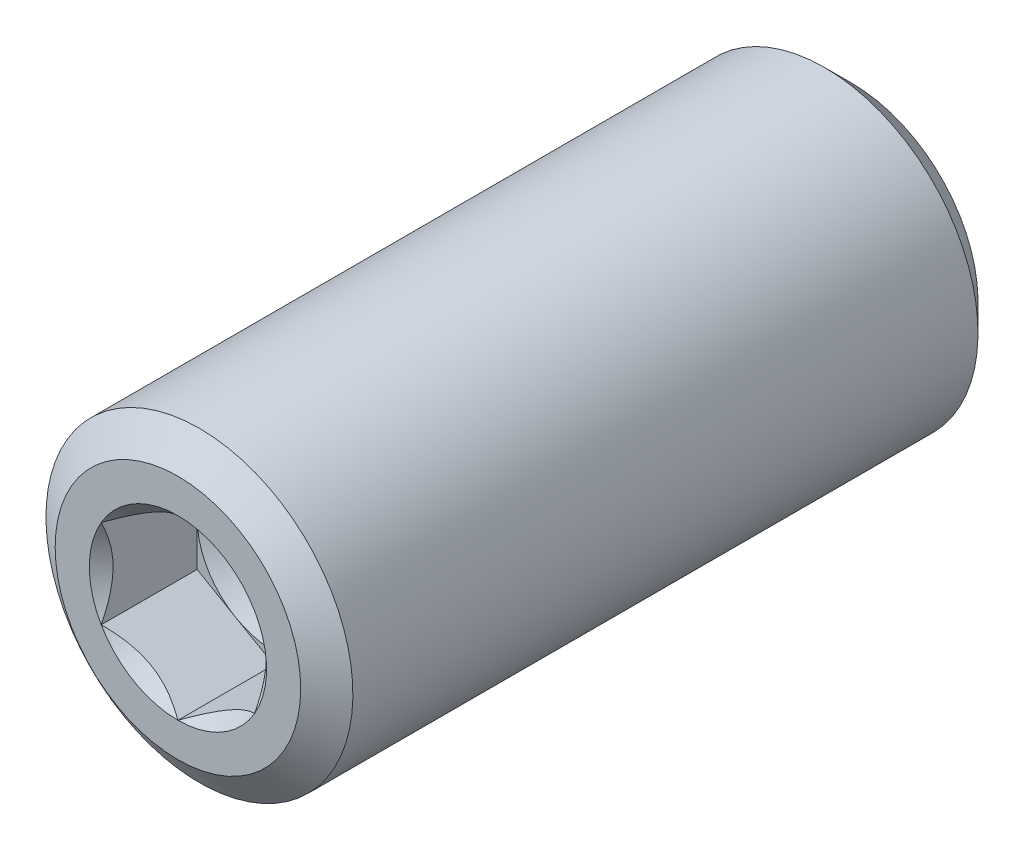
ISO-10303-21;
HEADER;
FILE_DESCRIPTION(('STEP AP214'),'2;1');
FILE_NAME('part.step','',(''),(''),'','','');
FILE_SCHEMA(('AUTOMOTIVE_DESIGN { 1 0 10303 214 1 1 1 1 }'));
ENDSEC;
DATA;
#1=APPLICATION_CONTEXT('core data for automotive mechanical design processes');
#2=APPLICATION_PROTOCOL_DEFINITION('international standard','automotive_design',2000,#1);
#3=PRODUCT_CONTEXT('',#1,'mechanical');
#4=PRODUCT('Part','Part','',(#3));
#5=PRODUCT_RELATED_PRODUCT_CATEGORY('part','',(#4));
#6=PRODUCT_DEFINITION_FORMATION('','',#4);
#7=PRODUCT_DEFINITION_CONTEXT('part definition',#1,'design');
#8=PRODUCT_DEFINITION('design','',#6,#7);
#9=PRODUCT_DEFINITION_SHAPE('','',#8);
#10=(LENGTH_UNIT() NAMED_UNIT(*) SI_UNIT(.MILLI.,.METRE.));
#11=(NAMED_UNIT(*) PLANE_ANGLE_UNIT() SI_UNIT($,.RADIAN.));
#12=(NAMED_UNIT(*) SI_UNIT($,.STERADIAN.) SOLID_ANGLE_UNIT());
#13=UNCERTAINTY_MEASURE_WITH_UNIT(LENGTH_MEASURE(1.E-05),#10,'distance_accuracy_value','');
#14=(GEOMETRIC_REPRESENTATION_CONTEXT(3) GLOBAL_UNCERTAINTY_ASSIGNED_CONTEXT((#13)) GLOBAL_UNIT_ASSIGNED_CONTEXT((#10,
#11,#12)) REPRESENTATION_CONTEXT('',''));
#15=CARTESIAN_POINT('',(0.,0.,0.));
#16=DIRECTION('',(0.,0.,1.));
#17=DIRECTION('',(1.,0.,0.));
#18=AXIS2_PLACEMENT_3D('',#15,#16,#17);
#19=CARTESIAN_POINT('',(0.,0.,-6.));
#20=DIRECTION('',(0.,0.,-1.));
#21=DIRECTION('',(0.,1.,0.));
#22=AXIS2_PLACEMENT_3D('',#19,#20,#21);
#23=SPHERICAL_SURFACE('',#22,1.5);
#24=CARTESIAN_POINT('',(0.,0.,-7.5));
#25=VERTEX_POINT('',#24);
#26=VERTEX_LOOP('',#25);
#27=FACE_BOUND('',#26,.T.);
#28=ADVANCED_FACE('F42',(#27),#23,.T.);
#29=CLOSED_SHELL('',(#28));
#30=MANIFOLD_SOLID_BREP('B2',#29);
#31=CARTESIAN_POINT('',(1.25,0.72168783648705,2.9375));
#32=DIRECTION('',(0.,0.,-1.));
#33=DIRECTION('',(-1.,0.,0.));
#34=AXIS2_PLACEMENT_3D('',#31,#32,#33);
#35=PLANE('',#34);
#36=DIRECTION('',(0.,-1.,0.));
#37=VECTOR('',#36,1.);
#38=CARTESIAN_POINT('',(-1.25,0.72168783648705,2.9375));
#39=LINE('',#38,#37);
#40=CARTESIAN_POINT('',(-1.25,0.72168783648705,2.9375));
#41=VERTEX_POINT('',#40);
#42=CARTESIAN_POINT('',(-1.25,0.,2.9375));
#43=VERTEX_POINT('',#42);
#44=EDGE_CURVE('E173',#41,#43,#39,.T.);
#45=ORIENTED_EDGE('',*,*,#44,.T.);
#46=CARTESIAN_POINT('',(0.,0.,2.9375));
#47=DIRECTION('',(0.,0.,1.));
#48=DIRECTION('',(1.,0.,0.));
#49=AXIS2_PLACEMENT_3D('',#46,#47,#48);
#50=CIRCLE('',#49,1.25);
#51=CARTESIAN_POINT('',(-0.625,1.08253175473057,2.9375));
#52=VERTEX_POINT('',#51);
#53=EDGE_CURVE('E70',#52,#43,#50,.T.);
#54=ORIENTED_EDGE('',*,*,#53,.F.);
#55=DIRECTION('',(-0.866025403784439,-0.5,0.));
#56=VECTOR('',#55,1.);
#57=CARTESIAN_POINT('',(0.,1.44337567297408,2.9375));
#58=LINE('',#57,#56);
#59=EDGE_CURVE('E162',#52,#41,#58,.T.);
#60=ORIENTED_EDGE('',*,*,#59,.T.);
#61=EDGE_LOOP('',(#45,#54,#60));
#62=FACE_BOUND('',#61,.T.);
#63=ADVANCED_FACE('F55',(#62),#35,.F.);
#64=CARTESIAN_POINT('',(0.,1.44337567297408,2.9375));
#65=VERTEX_POINT('',#64);
#66=EDGE_CURVE('E149',#65,#52,#58,.T.);
#67=ORIENTED_EDGE('',*,*,#66,.T.);
#68=CARTESIAN_POINT('',(0.625,1.08253175473057,2.9375));
#69=VERTEX_POINT('',#68);
#70=EDGE_CURVE('E135',#69,#52,#50,.T.);
#71=ORIENTED_EDGE('',*,*,#70,.F.);
#72=DIRECTION('',(-0.866025403784439,0.5,0.));
#73=VECTOR('',#72,1.);
#74=CARTESIAN_POINT('',(1.25,0.72168783648705,2.9375));
#75=LINE('',#74,#73);
#76=EDGE_CURVE('E146',#69,#65,#75,.T.);
#77=ORIENTED_EDGE('',*,*,#76,.T.);
#78=EDGE_LOOP('',(#67,#71,#77));
#79=FACE_BOUND('',#78,.T.);
#80=ADVANCED_FACE('F145',(#79),#35,.F.);
#81=CARTESIAN_POINT('',(1.25,0.72168783648705,2.9375));
#82=VERTEX_POINT('',#81);
#83=EDGE_CURVE('E153',#82,#69,#75,.T.);
#84=ORIENTED_EDGE('',*,*,#83,.T.);
#85=CARTESIAN_POINT('',(1.25,0.,2.9375));
#86=VERTEX_POINT('',#85);
#87=EDGE_CURVE('E133',#86,#69,#50,.T.);
#88=ORIENTED_EDGE('',*,*,#87,.F.);
#89=DIRECTION('',(0.,1.,0.));
#90=VECTOR('',#89,1.);
#91=CARTESIAN_POINT('',(1.25,-0.721687836487016,2.9375));
#92=LINE('',#91,#90);
#93=EDGE_CURVE('E160',#86,#82,#92,.T.);
#94=ORIENTED_EDGE('',*,*,#93,.T.);
#95=EDGE_LOOP('',(#84,#88,#94));
#96=FACE_BOUND('',#95,.T.);
#97=ADVANCED_FACE('F159',(#96),#35,.F.);
#98=CARTESIAN_POINT('',(1.25,-0.721687836487016,2.9375));
#99=VERTEX_POINT('',#98);
#100=EDGE_CURVE('E184',#99,#86,#92,.T.);
#101=ORIENTED_EDGE('',*,*,#100,.T.);
#102=CARTESIAN_POINT('',(0.625,-1.08253175473053,2.9375));
#103=VERTEX_POINT('',#102);
#104=EDGE_CURVE('E137',#103,#86,#50,.T.);
#105=ORIENTED_EDGE('',*,*,#104,.F.);
#106=DIRECTION('',(0.866025403784439,0.5,0.));
#107=VECTOR('',#106,1.);
#108=CARTESIAN_POINT('',(0.,-1.44337567297405,2.9375));
#109=LINE('',#108,#107);
#110=EDGE_CURVE('E180',#103,#99,#109,.T.);
#111=ORIENTED_EDGE('',*,*,#110,.T.);
#112=EDGE_LOOP('',(#101,#105,#111));
#113=FACE_BOUND('',#112,.T.);
#114=ADVANCED_FACE('F287',(#113),#35,.F.);
#115=CARTESIAN_POINT('',(0.,-1.44337567297405,2.9375));
#116=VERTEX_POINT('',#115);
#117=EDGE_CURVE('E181',#116,#103,#109,.T.);
#118=ORIENTED_EDGE('',*,*,#117,.T.);
#119=CARTESIAN_POINT('',(-0.625000000000001,-1.08253175473053,2.9375));
#120=VERTEX_POINT('',#119);
#121=EDGE_CURVE('E298',#120,#103,#50,.T.);
#122=ORIENTED_EDGE('',*,*,#121,.F.);
#123=DIRECTION('',(0.866025403784439,-0.5,0.));
#124=VECTOR('',#123,1.);
#125=CARTESIAN_POINT('',(-1.25,-0.721687836487015,2.9375));
#126=LINE('',#125,#124);
#127=EDGE_CURVE('E176',#120,#116,#126,.T.);
#128=ORIENTED_EDGE('',*,*,#127,.T.);
#129=EDGE_LOOP('',(#118,#122,#128));
#130=FACE_BOUND('',#129,.T.);
#131=ADVANCED_FACE('F283',(#130),#35,.F.);
#132=CARTESIAN_POINT('',(0.,0.,-6.));
#133=DIRECTION('',(0.,0.,-1.));
#134=DIRECTION('',(0.,-1.,0.));
#135=AXIS2_PLACEMENT_3D('',#132,#133,#134);
#136=SPHERICAL_SURFACE('',#135,1.55);
#137=CARTESIAN_POINT('',(0.,0.,-6.48));
#138=DIRECTION('',(0.,0.,-1.));
#139=DIRECTION('',(0.,1.,0.));
#140=AXIS2_PLACEMENT_3D('',#137,#138,#139);
#141=CIRCLE('',#140,1.47380460034565);
#142=CARTESIAN_POINT('',(0.,1.47380460034565,-6.48));
#143=VERTEX_POINT('',#142);
#144=EDGE_CURVE('E59',#143,#143,#141,.T.);
#145=ORIENTED_EDGE('',*,*,#144,.T.);
#146=EDGE_LOOP('',(#145));
#147=FACE_BOUND('',#146,.T.);
#148=ADVANCED_FACE('F57',(#147),#136,.F.);
#149=CARTESIAN_POINT('',(0.,2.05311588712133,-6.48));
#150=DIRECTION('',(0.,0.,-1.));
#151=DIRECTION('',(0.,1.,0.));
#152=AXIS2_PLACEMENT_3D('',#149,#150,#151);
#153=PLANE('',#152);
#154=CARTESIAN_POINT('',(0.,0.,-6.48));
#155=DIRECTION('',(0.,0.,-1.));
#156=DIRECTION('',(0.,1.,0.));
#157=AXIS2_PLACEMENT_3D('',#154,#155,#156);
#158=CIRCLE('',#157,2.05311588712133);
#159=CARTESIAN_POINT('',(0.,2.05311588712133,-6.48));
#160=VERTEX_POINT('',#159);
#161=EDGE_CURVE('E210',#160,#160,#158,.T.);
#162=ORIENTED_EDGE('',*,*,#161,.T.);
#163=EDGE_LOOP('',(#162));
#164=FACE_BOUND('',#163,.T.);
#165=ORIENTED_EDGE('',*,*,#144,.F.);
#166=EDGE_LOOP('',(#165));
#167=FACE_BOUND('',#166,.T.);
#168=ADVANCED_FACE('F293',(#164,#167),#153,.T.);
#169=CARTESIAN_POINT('',(0.,0.,-6.48));
#170=DIRECTION('',(0.,0.,1.));
#171=DIRECTION('',(0.,-1.,0.));
#172=AXIS2_PLACEMENT_3D('',#169,#170,#171);
#173=CONICAL_SURFACE('',#172,2.05311588712133,0.785398163397457);
#174=CARTESIAN_POINT('',(0.,0.,-6.03311588712133));
#175=DIRECTION('',(0.,0.,-1.));
#176=DIRECTION('',(0.,1.,0.));
#177=AXIS2_PLACEMENT_3D('',#174,#175,#176);
#178=CIRCLE('',#177,2.5);
#179=CARTESIAN_POINT('',(0.,2.5,-6.03311588712133));
#180=VERTEX_POINT('',#179);
#181=EDGE_CURVE('E207',#180,#180,#178,.T.);
#182=ORIENTED_EDGE('',*,*,#181,.T.);
#183=EDGE_LOOP('',(#182));
#184=FACE_BOUND('',#183,.T.);
#185=ORIENTED_EDGE('',*,*,#161,.F.);
#186=EDGE_LOOP('',(#185));
#187=FACE_BOUND('',#186,.T.);
#188=ADVANCED_FACE('F367',(#184,#187),#173,.T.);
#189=CARTESIAN_POINT('',(0.,0.,-7.5));
#190=DIRECTION('',(0.,0.,-1.));
#191=DIRECTION('',(0.,1.,0.));
#192=AXIS2_PLACEMENT_3D('',#189,#190,#191);
#193=CYLINDRICAL_SURFACE('',#192,2.5);
#194=CARTESIAN_POINT('',(0.,0.,4.14989623089515));
#195=DIRECTION('',(0.,0.,-1.));
#196=DIRECTION('',(0.,1.,0.));
#197=AXIS2_PLACEMENT_3D('',#194,#195,#196);
#198=CIRCLE('',#197,2.5);
#199=CARTESIAN_POINT('',(0.,2.5,4.14989623089515));
#200=VERTEX_POINT('',#199);
#201=EDGE_CURVE('E204',#200,#200,#198,.T.);
#202=ORIENTED_EDGE('',*,*,#201,.T.);
#203=EDGE_LOOP('',(#202));
#204=FACE_BOUND('',#203,.T.);
#205=ORIENTED_EDGE('',*,*,#181,.F.);
#206=EDGE_LOOP('',(#205));
#207=FACE_BOUND('',#206,.T.);
#208=ADVANCED_FACE('F360',(#204,#207),#193,.T.);
#209=CARTESIAN_POINT('',(0.,0.,4.14989623089515));
#210=DIRECTION('',(0.,0.,-1.));
#211=DIRECTION('',(0.,1.,0.));
#212=AXIS2_PLACEMENT_3D('',#209,#210,#211);
#213=CONICAL_SURFACE('',#212,2.5,0.959931088596883);
#214=CARTESIAN_POINT('',(0.,0.,4.5));
#215=DIRECTION('',(0.,0.,-1.));
#216=DIRECTION('',(0.,1.,0.));
#217=AXIS2_PLACEMENT_3D('',#214,#215,#216);
#218=CIRCLE('',#217,2.);
#219=CARTESIAN_POINT('',(0.,2.,4.5));
#220=VERTEX_POINT('',#219);
#221=EDGE_CURVE('E189',#220,#220,#218,.T.);
#222=ORIENTED_EDGE('',*,*,#221,.T.);
#223=EDGE_LOOP('',(#222));
#224=FACE_BOUND('',#223,.T.);
#225=ORIENTED_EDGE('',*,*,#201,.F.);
#226=EDGE_LOOP('',(#225));
#227=FACE_BOUND('',#226,.T.);
#228=ADVANCED_FACE('F355',(#224,#227),#213,.T.);
#229=CARTESIAN_POINT('',(0.,0.,4.5));
#230=DIRECTION('',(0.,0.,1.));
#231=DIRECTION('',(0.,-1.,0.));
#232=AXIS2_PLACEMENT_3D('',#229,#230,#231);
#233=PLANE('',#232);
#234=CARTESIAN_POINT('',(0.,0.,4.5));
#235=DIRECTION('',(0.,0.,1.));
#236=DIRECTION('',(1.,0.,0.));
#237=AXIS2_PLACEMENT_3D('',#234,#235,#236);
#238=CIRCLE('',#237,1.44337567297408);
#239=CARTESIAN_POINT('',(0.,-1.44337567297408,4.5));
#240=VERTEX_POINT('',#239);
#241=CARTESIAN_POINT('',(1.25000000000004,-0.721687836486995,4.5));
#242=VERTEX_POINT('',#241);
#243=EDGE_CURVE('E314',#240,#242,#238,.T.);
#244=ORIENTED_EDGE('',*,*,#243,.F.);
#245=CARTESIAN_POINT('',(-1.25,-0.721687836487015,4.5));
#246=VERTEX_POINT('',#245);
#247=EDGE_CURVE('E315',#246,#240,#238,.T.);
#248=ORIENTED_EDGE('',*,*,#247,.F.);
#249=CARTESIAN_POINT('',(-1.25000000000001,0.721687836487045,4.5));
#250=VERTEX_POINT('',#249);
#251=EDGE_CURVE('E313',#250,#246,#238,.T.);
#252=ORIENTED_EDGE('',*,*,#251,.F.);
#253=CARTESIAN_POINT('',(0.,1.44337567297408,4.5));
#254=VERTEX_POINT('',#253);
#255=EDGE_CURVE('E308',#254,#250,#238,.T.);
#256=ORIENTED_EDGE('',*,*,#255,.F.);
#257=CARTESIAN_POINT('',(1.25,0.721687836487061,4.5));
#258=VERTEX_POINT('',#257);
#259=EDGE_CURVE('E307',#258,#254,#238,.T.);
#260=ORIENTED_EDGE('',*,*,#259,.F.);
#261=EDGE_CURVE('E77',#242,#258,#238,.T.);
#262=ORIENTED_EDGE('',*,*,#261,.F.);
#263=EDGE_LOOP('',(#244,#248,#252,#256,#260,#262));
#264=FACE_BOUND('',#263,.T.);
#265=ORIENTED_EDGE('',*,*,#221,.F.);
#266=EDGE_LOOP('',(#265));
#267=FACE_BOUND('',#266,.T.);
#268=ADVANCED_FACE('F327',(#264,#267),#233,.T.);
#269=CARTESIAN_POINT('',(0.,0.,4.5));
#270=DIRECTION('',(0.,0.,1.));
#271=DIRECTION('',(1.,0.,0.));
#272=AXIS2_PLACEMENT_3D('',#269,#270,#271);
#273=CONICAL_SURFACE('',#272,1.44337567297408,0.78539816339745);
#274=ORIENTED_EDGE('',*,*,#255,.T.);
#275=CARTESIAN_POINT('',(0.000200000000000185,1.44349114302792,4.50011548390914));
#276=CARTESIAN_POINT('',(-0.0427751670715872,1.41867941875067,4.47532166805511));
#277=CARTESIAN_POINT('',(-0.0864690047459489,1.39345276980745,4.45198373441869));
#278=CARTESIAN_POINT('',(-0.175565930841944,1.34201263554196,4.40925200408454));
#279=CARTESIAN_POINT('',(-0.220977498357066,1.31579425481278,4.38988199236042));
#280=CARTESIAN_POINT('',(-0.312547820935263,1.26292610442248,4.35670048341348));
#281=CARTESIAN_POINT('',(-0.358683240175889,1.23628980770472,4.34280555905266));
#282=CARTESIAN_POINT('',(-0.451970080407597,1.1824306253851,4.32139728216064));
#283=CARTESIAN_POINT('',(-0.499118649136385,1.15520938653763,4.31386794156679));
#284=CARTESIAN_POINT('',(-0.580373556887258,1.10829684367468,4.3070744980507));
#285=CARTESIAN_POINT('',(-0.614374876627947,1.08866617256959,4.30606855910435));
#286=CARTESIAN_POINT('',(-0.682317764432484,1.04943932800612,4.30776141491132));
#287=CARTESIAN_POINT('',(-0.716259317655665,1.02984316311601,4.31046102721554));
#288=CARTESIAN_POINT('',(-0.783814856457508,0.990839954603512,4.31940893031638));
#289=CARTESIAN_POINT('',(-0.817428507286784,0.971433104248784,4.32566052589971));
#290=CARTESIAN_POINT('',(-0.884094638217822,0.932943395609918,4.34137568141391));
#291=CARTESIAN_POINT('',(-0.917146871030305,0.913860680098312,4.35084062008746));
#292=CARTESIAN_POINT('',(-1.00179969160027,0.864986351354581,4.37893139068759));
#293=CARTESIAN_POINT('',(-1.05286649242964,0.83550292014909,4.3996701574522));
#294=CARTESIAN_POINT('',(-1.15300085411326,0.777690319475924,4.44638713467147));
#295=CARTESIAN_POINT('',(-1.20207431157827,0.749357745598433,4.47234829594676));
#296=CARTESIAN_POINT('',(-1.2502,0.721572366433212,4.50011548390913));
#297=B_SPLINE_CURVE_WITH_KNOTS('',3,(#275,#276,#277,#278,#279,#280,#281,#282,#283,#284,#285,
#286,#287,#288,#289,#290,#291,#292,#293,#294,#295,#296),.UNSPECIFIED.,.F.,.F.,(4,2,2,2,2,2,2,2,
2,2,4),(0.,0.166533409618305,0.334037607289765,0.498880396489704,0.663307919240281,
0.780963963458835,0.898645970148462,1.01643764860774,1.13427993171551,1.32148652032141,
1.50809158792573),.UNSPECIFIED.);
#298=EDGE_CURVE('E40',#254,#250,#297,.T.);
#299=ORIENTED_EDGE('',*,*,#298,.F.);
#300=EDGE_LOOP('',(#274,#299));
#301=FACE_BOUND('',#300,.T.);
#302=ADVANCED_FACE('F226',(#301),#273,.F.);
#303=ORIENTED_EDGE('',*,*,#251,.T.);
#304=CARTESIAN_POINT('',(-1.25,-1.43934010808075,4.9629820968923));
#305=CARTESIAN_POINT('',(-1.25,-1.40429313005656,4.93652492263286));
#306=CARTESIAN_POINT('',(-1.25,-1.36905087135597,4.91032716035425));
#307=CARTESIAN_POINT('',(-1.25,-1.29809650706309,4.85855757183956));
#308=CARTESIAN_POINT('',(-1.25,-1.26238428576493,4.83298590435627));
#309=CARTESIAN_POINT('',(-1.25,-1.15390111792706,4.75700599368944));
#310=CARTESIAN_POINT('',(-1.25,-1.08031646726262,4.70774028618954));
#311=CARTESIAN_POINT('',(-1.25,-0.926012322755079,4.61102583026311));
#312=CARTESIAN_POINT('',(-1.25,-0.845125318656131,4.56384129894178));
#313=CARTESIAN_POINT('',(-1.25,-0.679311174076589,4.4775307343904));
#314=CARTESIAN_POINT('',(-1.25,-0.594398891026676,4.43837753462688));
#315=CARTESIAN_POINT('',(-1.25,-0.46694481246073,4.39047722368828));
#316=CARTESIAN_POINT('',(-1.25,-0.426289985812812,4.37672948978632));
#317=CARTESIAN_POINT('',(-1.25,-0.343998850091258,4.35249792745053));
#318=CARTESIAN_POINT('',(-1.25,-0.302362473614953,4.34201432386976));
#319=CARTESIAN_POINT('',(-1.25,-0.219052696285657,4.32503016174828));
#320=CARTESIAN_POINT('',(-1.25,-0.177393428474491,4.31846136047136));
#321=CARTESIAN_POINT('',(-1.25,-0.0936293693401842,4.30943505345775));
#322=CARTESIAN_POINT('',(-1.25,-0.0515246558543884,4.30697684099725));
#323=CARTESIAN_POINT('',(-1.25,0.0311890576306385,4.30635406201327));
#324=CARTESIAN_POINT('',(-1.25,0.071796962549937,4.30803711684623));
#325=CARTESIAN_POINT('',(-1.25,0.152668636885203,4.3152682705979));
#326=CARTESIAN_POINT('',(-1.25,0.192932338835364,4.3208171104131));
#327=CARTESIAN_POINT('',(-1.25,0.2734998791653,4.33557103646494));
#328=CARTESIAN_POINT('',(-1.25,0.313792180618516,4.34483817596409));
#329=CARTESIAN_POINT('',(-1.25,0.393496413911461,4.36653617845734));
#330=CARTESIAN_POINT('',(-1.25,0.432908419115063,4.37896677673063));
#331=CARTESIAN_POINT('',(-1.25,0.556992735862302,4.42277935293142));
#332=CARTESIAN_POINT('',(-1.25,0.63989892466609,4.45915107287594));
#333=CARTESIAN_POINT('',(-1.25,0.801816555499706,4.54001916217832));
#334=CARTESIAN_POINT('',(-1.25,0.88081266632505,4.58454472091198));
#335=CARTESIAN_POINT('',(-1.25,1.0317856127975,4.67640487666662));
#336=CARTESIAN_POINT('',(-1.25,1.10391618485086,4.72348993391624));
#337=CARTESIAN_POINT('',(-1.25,1.21018606043311,4.79627856159853));
#338=CARTESIAN_POINT('',(-1.25,1.2451506996938,4.82079808539335));
#339=CARTESIAN_POINT('',(-1.25,1.31460220852737,4.87048563676567));
#340=CARTESIAN_POINT('',(-1.25,1.34908920596619,4.89565348541551));
#341=CARTESIAN_POINT('',(-1.25,1.38337731682912,4.9210901488412));
#342=B_SPLINE_CURVE_WITH_KNOTS('',3,(#304,#305,#306,#307,#308,#309,#310,#311,#312,#313,#314,
#315,#316,#317,#318,#319,#320,#321,#322,#323,#324,#325,#326,#327,#328,#329,#330,#331,#332,#333,
#334,#335,#336,#337,#338,#339,#340,#341),.UNSPECIFIED.,.F.,.F.,(4,2,2,2,2,2,2,2,2,2,2,2,2,2,2,2,
2,2,4),(0.,0.131732960381446,0.26349898416164,0.529042014455817,0.809741926134606,
1.08947609717223,1.21811634272575,1.34676544783898,1.47310084517842,1.59941451973782,
1.72115042167847,1.84290966131733,1.96679153905339,2.09066305366037,2.36146692896007,
2.63325989198489,2.89154668212277,3.01965734507711,3.14773302245626),.UNSPECIFIED.);
#343=EDGE_CURVE('E233',#250,#246,#342,.F.);
#344=ORIENTED_EDGE('',*,*,#343,.F.);
#345=EDGE_LOOP('',(#303,#344));
#346=FACE_BOUND('',#345,.T.);
#347=ADVANCED_FACE('F324',(#346),#273,.F.);
#348=ORIENTED_EDGE('',*,*,#247,.T.);
#349=CARTESIAN_POINT('',(-1.2502,-0.721572366433177,4.50011548390911));
#350=CARTESIAN_POINT('',(-1.20722483292841,-0.746384090710427,4.47532166805508));
#351=CARTESIAN_POINT('',(-1.16353099525405,-0.771610739653648,4.45198373441866));
#352=CARTESIAN_POINT('',(-1.07443406915806,-0.823050873919139,4.40925200408451));
#353=CARTESIAN_POINT('',(-1.02902250164293,-0.849269254648317,4.38988199236039));
#354=CARTESIAN_POINT('',(-0.937452179064738,-0.90213740503862,4.35670048341345));
#355=CARTESIAN_POINT('',(-0.891316759824112,-0.928773701756372,4.34280555905263));
#356=CARTESIAN_POINT('',(-0.798029919592404,-0.982632884075998,4.32139728216061));
#357=CARTESIAN_POINT('',(-0.750881350863616,-1.00985412292347,4.31386794156676));
#358=CARTESIAN_POINT('',(-0.669626443112743,-1.05676666578641,4.30707449805068));
#359=CARTESIAN_POINT('',(-0.635625123372055,-1.0763973368915,4.30606855910432));
#360=CARTESIAN_POINT('',(-0.567682235567519,-1.11562418145497,4.30776141491129));
#361=CARTESIAN_POINT('',(-0.533740682344339,-1.13522034634509,4.31046102721551));
#362=CARTESIAN_POINT('',(-0.466185143542498,-1.17422355485758,4.31940893031635));
#363=CARTESIAN_POINT('',(-0.432571492713223,-1.19363040521231,4.32566052589968));
#364=CARTESIAN_POINT('',(-0.365905361782186,-1.23212011385118,4.34137568141388));
#365=CARTESIAN_POINT('',(-0.332853128969703,-1.25120282936278,4.35084062008743));
#366=CARTESIAN_POINT('',(-0.248200308399735,-1.30007715810651,4.37893139068756));
#367=CARTESIAN_POINT('',(-0.197133507570361,-1.329560589312,4.39967015745217));
#368=CARTESIAN_POINT('',(-0.0969991458867451,-1.38737318998517,4.44638713467145));
#369=CARTESIAN_POINT('',(-0.0479256884217306,-1.41570576386266,4.47234829594674));
#370=CARTESIAN_POINT('',(0.000199999999999671,-1.44349114302789,4.50011548390911));
#371=B_SPLINE_CURVE_WITH_KNOTS('',3,(#349,#350,#351,#352,#353,#354,#355,#356,#357,#358,#359,
#360,#361,#362,#363,#364,#365,#366,#367,#368,#369,#370),.UNSPECIFIED.,.F.,.F.,(4,2,2,2,2,2,2,2,
2,2,4),(0.,0.166533409618305,0.334037607289765,0.498880396489703,0.663307919240281,
0.780963963458832,0.898645970148458,1.01643764860774,1.1342799317155,1.32148652032141,
1.50809158792574),.UNSPECIFIED.);
#372=EDGE_CURVE('E240',#246,#240,#371,.T.);
#373=ORIENTED_EDGE('',*,*,#372,.F.);
#374=EDGE_LOOP('',(#348,#373));
#375=FACE_BOUND('',#374,.T.);
#376=ADVANCED_FACE('F342',(#375),#273,.F.);
#377=ORIENTED_EDGE('',*,*,#243,.T.);
#378=CARTESIAN_POINT('',(-0.000200000000000397,-1.44349114302789,4.50011548390911));
#379=CARTESIAN_POINT('',(0.0427751670715855,-1.41867941875064,4.47532166805508));
#380=CARTESIAN_POINT('',(0.0864690047459463,-1.39345276980742,4.45198373441866));
#381=CARTESIAN_POINT('',(0.175565930841939,-1.34201263554193,4.40925200408451));
#382=CARTESIAN_POINT('',(0.220977498357061,-1.31579425481275,4.38988199236039));
#383=CARTESIAN_POINT('',(0.312547820935256,-1.26292610442245,4.35670048341345));
#384=CARTESIAN_POINT('',(0.358683240175881,-1.2362898077047,4.34280555905263));
#385=CARTESIAN_POINT('',(0.451970080407586,-1.18243062538507,4.32139728216061));
#386=CARTESIAN_POINT('',(0.499118649136373,-1.1552093865376,4.31386794156676));
#387=CARTESIAN_POINT('',(0.580373556887245,-1.10829684367466,4.30707449805068));
#388=CARTESIAN_POINT('',(0.614374876627933,-1.08866617256957,4.30606855910432));
#389=CARTESIAN_POINT('',(0.682317764432469,-1.0494393280061,4.30776141491129));
#390=CARTESIAN_POINT('',(0.716259317655649,-1.02984316311598,4.31046102721551));
#391=CARTESIAN_POINT('',(0.78381485645749,-0.990839954603488,4.31940893031635));
#392=CARTESIAN_POINT('',(0.817428507286765,-0.97143310424876,4.32566052589968));
#393=CARTESIAN_POINT('',(0.884094638217802,-0.932943395609895,4.34137568141388));
#394=CARTESIAN_POINT('',(0.917146871030284,-0.91386068009829,4.35084062008743));
#395=CARTESIAN_POINT('',(1.00179969160025,-0.864986351354557,4.37893139068756));
#396=CARTESIAN_POINT('',(1.05286649242963,-0.835502920149063,4.39967015745218));
#397=CARTESIAN_POINT('',(1.15300085411325,-0.777690319475894,4.44638713467145));
#398=CARTESIAN_POINT('',(1.20207431157827,-0.749357745598401,4.47234829594674));
#399=CARTESIAN_POINT('',(1.2502,-0.721572366433178,4.50011548390911));
#400=B_SPLINE_CURVE_WITH_KNOTS('',3,(#378,#379,#380,#381,#382,#383,#384,#385,#386,#387,#388,
#389,#390,#391,#392,#393,#394,#395,#396,#397,#398,#399),.UNSPECIFIED.,.F.,.F.,(4,2,2,2,2,2,2,2,
2,2,4),(0.,0.166533409618301,0.334037607289758,0.498880396489692,0.663307919240266,
0.780963963458817,0.898645970148442,1.01643764860772,1.13427993171548,1.3214865203214,
1.50809158792574),.UNSPECIFIED.);
#401=EDGE_CURVE('E246',#240,#242,#400,.T.);
#402=ORIENTED_EDGE('',*,*,#401,.F.);
#403=EDGE_LOOP('',(#377,#402));
#404=FACE_BOUND('',#403,.T.);
#405=ADVANCED_FACE('F338',(#404),#273,.F.);
#406=ORIENTED_EDGE('',*,*,#261,.T.);
#407=CARTESIAN_POINT('',(1.25,-1.43934010808075,4.9629820968923));
#408=CARTESIAN_POINT('',(1.25,-1.40429313005657,4.93652492263286));
#409=CARTESIAN_POINT('',(1.25,-1.36905087135597,4.91032716035425));
#410=CARTESIAN_POINT('',(1.25,-1.29809650706309,4.85855757183956));
#411=CARTESIAN_POINT('',(1.25,-1.26238428576493,4.83298590435627));
#412=CARTESIAN_POINT('',(1.25,-1.15390111792706,4.75700599368944));
#413=CARTESIAN_POINT('',(1.25,-1.08031646726263,4.70774028618954));
#414=CARTESIAN_POINT('',(1.25,-0.926012322755081,4.61102583026311));
#415=CARTESIAN_POINT('',(1.25,-0.845125318656133,4.56384129894178));
#416=CARTESIAN_POINT('',(1.25,-0.67931117407659,4.4775307343904));
#417=CARTESIAN_POINT('',(1.25,-0.594398891026677,4.43837753462688));
#418=CARTESIAN_POINT('',(1.25,-0.466944812460731,4.39047722368828));
#419=CARTESIAN_POINT('',(1.25,-0.426289985812812,4.37672948978632));
#420=CARTESIAN_POINT('',(1.25,-0.343998850091259,4.35249792745053));
#421=CARTESIAN_POINT('',(1.25,-0.302362473614954,4.34201432386976));
#422=CARTESIAN_POINT('',(1.25,-0.219052696285658,4.32503016174828));
#423=CARTESIAN_POINT('',(1.25,-0.177393428474492,4.31846136047136));
#424=CARTESIAN_POINT('',(1.25,-0.0936293693401853,4.30943505345775));
#425=CARTESIAN_POINT('',(1.25,-0.0515246558543896,4.30697684099725));
#426=CARTESIAN_POINT('',(1.25,0.0311890576306374,4.30635406201327));
#427=CARTESIAN_POINT('',(1.25,0.0717969625499359,4.30803711684623));
#428=CARTESIAN_POINT('',(1.25,0.152668636885202,4.3152682705979));
#429=CARTESIAN_POINT('',(1.25,0.192932338835363,4.32081711041309));
#430=CARTESIAN_POINT('',(1.25,0.273499879165299,4.33557103646494));
#431=CARTESIAN_POINT('',(1.25,0.313792180618515,4.34483817596409));
#432=CARTESIAN_POINT('',(1.25,0.393496413911461,4.36653617845734));
#433=CARTESIAN_POINT('',(1.25,0.432908419115062,4.37896677673063));
#434=CARTESIAN_POINT('',(1.25,0.556992735862301,4.42277935293142));
#435=CARTESIAN_POINT('',(1.25,0.639898924666089,4.45915107287594));
#436=CARTESIAN_POINT('',(1.25,0.801816555499705,4.54001916217832));
#437=CARTESIAN_POINT('',(1.25,0.880812666325048,4.58454472091197));
#438=CARTESIAN_POINT('',(1.25,1.0317856127975,4.67640487666661));
#439=CARTESIAN_POINT('',(1.25,1.10391618485086,4.72348993391624));
#440=CARTESIAN_POINT('',(1.25,1.21018606043311,4.79627856159853));
#441=CARTESIAN_POINT('',(1.25,1.2451506996938,4.82079808539335));
#442=CARTESIAN_POINT('',(1.25,1.31460220852737,4.87048563676567));
#443=CARTESIAN_POINT('',(1.25,1.34908920596618,4.89565348541551));
#444=CARTESIAN_POINT('',(1.25,1.38337731682912,4.9210901488412));
#445=B_SPLINE_CURVE_WITH_KNOTS('',3,(#407,#408,#409,#410,#411,#412,#413,#414,#415,#416,#417,
#418,#419,#420,#421,#422,#423,#424,#425,#426,#427,#428,#429,#430,#431,#432,#433,#434,#435,#436,
#437,#438,#439,#440,#441,#442,#443,#444),.UNSPECIFIED.,.F.,.F.,(4,2,2,2,2,2,2,2,2,2,2,2,2,2,2,2,
2,2,4),(0.,0.131732960381447,0.263498984161641,0.529042014455818,0.809741926134607,
1.08947609717224,1.21811634272575,1.34676544783899,1.47310084517842,1.59941451973782,
1.72115042167847,1.84290966131733,1.96679153905339,2.09066305366037,2.36146692896007,
2.63325989198489,2.89154668212277,3.01965734507711,3.14773302245626),.UNSPECIFIED.);
#446=EDGE_CURVE('E251',#242,#258,#445,.T.);
#447=ORIENTED_EDGE('',*,*,#446,.F.);
#448=EDGE_LOOP('',(#406,#447));
#449=FACE_BOUND('',#448,.T.);
#450=ADVANCED_FACE('F224',(#449),#273,.F.);
#451=ORIENTED_EDGE('',*,*,#259,.T.);
#452=CARTESIAN_POINT('',(1.2502,0.721572366433212,4.50011548390913));
#453=CARTESIAN_POINT('',(1.20722483292841,0.746384090710462,4.4753216680551));
#454=CARTESIAN_POINT('',(1.16353099525405,0.771610739653682,4.45198373441868));
#455=CARTESIAN_POINT('',(1.07443406915806,0.823050873919172,4.40925200408453));
#456=CARTESIAN_POINT('',(1.02902250164294,0.84926925464835,4.38988199236041));
#457=CARTESIAN_POINT('',(0.937452179064743,0.902137405038651,4.35670048341348));
#458=CARTESIAN_POINT('',(0.891316759824118,0.928773701756403,4.34280555905266));
#459=CARTESIAN_POINT('',(0.798029919592412,0.982632884076028,4.32139728216064));
#460=CARTESIAN_POINT('',(0.750881350863625,1.0098541229235,4.31386794156679));
#461=CARTESIAN_POINT('',(0.669626443112753,1.05676666578644,4.3070744980507));
#462=CARTESIAN_POINT('',(0.635625123372064,1.07639733689153,4.30606855910435));
#463=CARTESIAN_POINT('',(0.567682235567527,1.115624181455,4.30776141491132));
#464=CARTESIAN_POINT('',(0.533740682344346,1.13522034634512,4.31046102721554));
#465=CARTESIAN_POINT('',(0.466185143542504,1.17422355485761,4.31940893031638));
#466=CARTESIAN_POINT('',(0.432571492713228,1.19363040521234,4.32566052589971));
#467=CARTESIAN_POINT('',(0.365905361782189,1.23212011385121,4.34137568141391));
#468=CARTESIAN_POINT('',(0.332853128969706,1.25120282936281,4.35084062008746));
#469=CARTESIAN_POINT('',(0.248200308399737,1.30007715810655,4.37893139068759));
#470=CARTESIAN_POINT('',(0.197133507570363,1.32956058931204,4.3996701574522));
#471=CARTESIAN_POINT('',(0.0969991458867462,1.38737318998521,4.44638713467148));
#472=CARTESIAN_POINT('',(0.0479256884217314,1.4157057638627,4.47234829594677));
#473=CARTESIAN_POINT('',(-0.000199999999999588,1.44349114302792,4.50011548390914));
#474=B_SPLINE_CURVE_WITH_KNOTS('',3,(#452,#453,#454,#455,#456,#457,#458,#459,#460,#461,#462,
#463,#464,#465,#466,#467,#468,#469,#470,#471,#472,#473),.UNSPECIFIED.,.F.,.F.,(4,2,2,2,2,2,2,2,
2,2,4),(0.,0.166533409618301,0.334037607289757,0.498880396489692,0.663307919240266,
0.78096396345882,0.898645970148447,1.01643764860773,1.13427993171549,1.3214865203214,
1.50809158792573),.UNSPECIFIED.);
#475=EDGE_CURVE('E157',#258,#254,#474,.T.);
#476=ORIENTED_EDGE('',*,*,#475,.F.);
#477=EDGE_LOOP('',(#451,#476));
#478=FACE_BOUND('',#477,.T.);
#479=ADVANCED_FACE('F219',(#478),#273,.F.);
#480=CARTESIAN_POINT('',(-1.25,-0.721687836487015,2.9375));
#481=VERTEX_POINT('',#480);
#482=EDGE_CURVE('E177',#481,#120,#126,.T.);
#483=ORIENTED_EDGE('',*,*,#482,.T.);
#484=EDGE_CURVE('E306',#43,#120,#50,.T.);
#485=ORIENTED_EDGE('',*,*,#484,.F.);
#486=EDGE_CURVE('E172',#43,#481,#39,.T.);
#487=ORIENTED_EDGE('',*,*,#486,.T.);
#488=EDGE_LOOP('',(#483,#485,#487));
#489=FACE_BOUND('',#488,.T.);
#490=ADVANCED_FACE('F223',(#489),#35,.F.);
#491=CARTESIAN_POINT('',(0.,1.44337567297408,2.9375));
#492=DIRECTION('',(-0.5,0.866025403784439,0.));
#493=DIRECTION('',(-0.866025403784439,-0.5,0.));
#494=AXIS2_PLACEMENT_3D('',#491,#492,#493);
#495=PLANE('',#494);
#496=DIRECTION('',(0.,0.,1.));
#497=VECTOR('',#496,1.);
#498=CARTESIAN_POINT('',(0.,1.44337567297408,2.9375));
#499=LINE('',#498,#497);
#500=EDGE_CURVE('E156',#65,#254,#499,.T.);
#501=ORIENTED_EDGE('',*,*,#500,.T.);
#502=ORIENTED_EDGE('',*,*,#298,.T.);
#503=DIRECTION('',(0.,0.,1.));
#504=VECTOR('',#503,1.);
#505=CARTESIAN_POINT('',(-1.25,0.72168783648705,2.9375));
#506=LINE('',#505,#504);
#507=EDGE_CURVE('E198',#41,#250,#506,.T.);
#508=ORIENTED_EDGE('',*,*,#507,.F.);
#509=ORIENTED_EDGE('',*,*,#59,.F.);
#510=ORIENTED_EDGE('',*,*,#66,.F.);
#511=EDGE_LOOP('',(#501,#502,#508,#509,#510));
#512=FACE_BOUND('',#511,.T.);
#513=ADVANCED_FACE('F216',(#512),#495,.F.);
#514=CARTESIAN_POINT('',(-1.25,0.72168783648705,2.9375));
#515=DIRECTION('',(-1.,0.,0.));
#516=DIRECTION('',(0.,0.,1.));
#517=AXIS2_PLACEMENT_3D('',#514,#515,#516);
#518=PLANE('',#517);
#519=ORIENTED_EDGE('',*,*,#507,.T.);
#520=ORIENTED_EDGE('',*,*,#343,.T.);
#521=DIRECTION('',(0.,0.,1.));
#522=VECTOR('',#521,1.);
#523=CARTESIAN_POINT('',(-1.25,-0.721687836487015,2.9375));
#524=LINE('',#523,#522);
#525=EDGE_CURVE('E196',#481,#246,#524,.T.);
#526=ORIENTED_EDGE('',*,*,#525,.F.);
#527=ORIENTED_EDGE('',*,*,#486,.F.);
#528=ORIENTED_EDGE('',*,*,#44,.F.);
#529=EDGE_LOOP('',(#519,#520,#526,#527,#528));
#530=FACE_BOUND('',#529,.T.);
#531=ADVANCED_FACE('F267',(#530),#518,.F.);
#532=CARTESIAN_POINT('',(-1.25,-0.721687836487015,2.9375));
#533=DIRECTION('',(-0.5,-0.866025403784439,0.));
#534=DIRECTION('',(0.866025403784439,-0.5,0.));
#535=AXIS2_PLACEMENT_3D('',#532,#533,#534);
#536=PLANE('',#535);
#537=ORIENTED_EDGE('',*,*,#525,.T.);
#538=ORIENTED_EDGE('',*,*,#372,.T.);
#539=DIRECTION('',(0.,0.,1.));
#540=VECTOR('',#539,1.);
#541=CARTESIAN_POINT('',(0.,-1.44337567297405,2.9375));
#542=LINE('',#541,#540);
#543=EDGE_CURVE('E193',#116,#240,#542,.T.);
#544=ORIENTED_EDGE('',*,*,#543,.F.);
#545=ORIENTED_EDGE('',*,*,#127,.F.);
#546=ORIENTED_EDGE('',*,*,#482,.F.);
#547=EDGE_LOOP('',(#537,#538,#544,#545,#546));
#548=FACE_BOUND('',#547,.T.);
#549=ADVANCED_FACE('F263',(#548),#536,.F.);
#550=CARTESIAN_POINT('',(0.,-1.44337567297405,2.9375));
#551=DIRECTION('',(0.5,-0.866025403784439,0.));
#552=DIRECTION('',(0.866025403784439,0.5,0.));
#553=AXIS2_PLACEMENT_3D('',#550,#551,#552);
#554=PLANE('',#553);
#555=ORIENTED_EDGE('',*,*,#543,.T.);
#556=ORIENTED_EDGE('',*,*,#401,.T.);
#557=DIRECTION('',(0.,0.,1.));
#558=VECTOR('',#557,1.);
#559=CARTESIAN_POINT('',(1.25,-0.721687836487016,2.9375));
#560=LINE('',#559,#558);
#561=EDGE_CURVE('E190',#99,#242,#560,.T.);
#562=ORIENTED_EDGE('',*,*,#561,.F.);
#563=ORIENTED_EDGE('',*,*,#110,.F.);
#564=ORIENTED_EDGE('',*,*,#117,.F.);
#565=EDGE_LOOP('',(#555,#556,#562,#563,#564));
#566=FACE_BOUND('',#565,.T.);
#567=ADVANCED_FACE('F259',(#566),#554,.F.);
#568=CARTESIAN_POINT('',(1.25,-0.721687836487016,2.9375));
#569=DIRECTION('',(1.,0.,0.));
#570=DIRECTION('',(0.,1.,0.));
#571=AXIS2_PLACEMENT_3D('',#568,#569,#570);
#572=PLANE('',#571);
#573=ORIENTED_EDGE('',*,*,#561,.T.);
#574=ORIENTED_EDGE('',*,*,#446,.T.);
#575=DIRECTION('',(0.,0.,1.));
#576=VECTOR('',#575,1.);
#577=CARTESIAN_POINT('',(1.25,0.72168783648705,2.9375));
#578=LINE('',#577,#576);
#579=EDGE_CURVE('E187',#82,#258,#578,.T.);
#580=ORIENTED_EDGE('',*,*,#579,.F.);
#581=ORIENTED_EDGE('',*,*,#93,.F.);
#582=ORIENTED_EDGE('',*,*,#100,.F.);
#583=EDGE_LOOP('',(#573,#574,#580,#581,#582));
#584=FACE_BOUND('',#583,.T.);
#585=ADVANCED_FACE('F256',(#584),#572,.F.);
#586=CARTESIAN_POINT('',(1.25,0.72168783648705,2.9375));
#587=DIRECTION('',(0.5,0.866025403784439,0.));
#588=DIRECTION('',(-0.866025403784439,0.5,0.));
#589=AXIS2_PLACEMENT_3D('',#586,#587,#588);
#590=PLANE('',#589);
#591=ORIENTED_EDGE('',*,*,#579,.T.);
#592=ORIENTED_EDGE('',*,*,#475,.T.);
#593=ORIENTED_EDGE('',*,*,#500,.F.);
#594=ORIENTED_EDGE('',*,*,#76,.F.);
#595=ORIENTED_EDGE('',*,*,#83,.F.);
#596=EDGE_LOOP('',(#591,#592,#593,#594,#595));
#597=FACE_BOUND('',#596,.T.);
#598=ADVANCED_FACE('F130',(#597),#590,.F.);
#599=CARTESIAN_POINT('',(0.,0.,2.9375));
#600=DIRECTION('',(0.,0.,1.));
#601=DIRECTION('',(1.,0.,0.));
#602=AXIS2_PLACEMENT_3D('',#599,#600,#601);
#603=CONICAL_SURFACE('',#602,1.25,1.0471975511966);
#604=CARTESIAN_POINT('',(0.,0.,2.21581216351297));
#605=VERTEX_POINT('',#604);
#606=VERTEX_LOOP('',#605);
#607=FACE_BOUND('',#606,.T.);
#608=ORIENTED_EDGE('',*,*,#87,.T.);
#609=ORIENTED_EDGE('',*,*,#70,.T.);
#610=ORIENTED_EDGE('',*,*,#53,.T.);
#611=ORIENTED_EDGE('',*,*,#484,.T.);
#612=ORIENTED_EDGE('',*,*,#121,.T.);
#613=ORIENTED_EDGE('',*,*,#104,.T.);
#614=EDGE_LOOP('',(#608,#609,#610,#611,#612,#613));
#615=FACE_BOUND('',#614,.T.);
#616=ADVANCED_FACE('F128',(#607,#615),#603,.F.);
#617=CLOSED_SHELL('',(#63,#80,#97,#114,#131,#148,#168,#188,#208,#228,#268,#302,#347,#376,#405,
#450,#479,#490,#513,#531,#549,#567,#585,#598,#616));
#618=MANIFOLD_SOLID_BREP('B7',#617);
#619=ADVANCED_BREP_SHAPE_REPRESENTATION('',(#18,#30,#618),#14);
#620=SHAPE_DEFINITION_REPRESENTATION(#9,#619);
ENDSEC;
END-ISO-10303-21;
